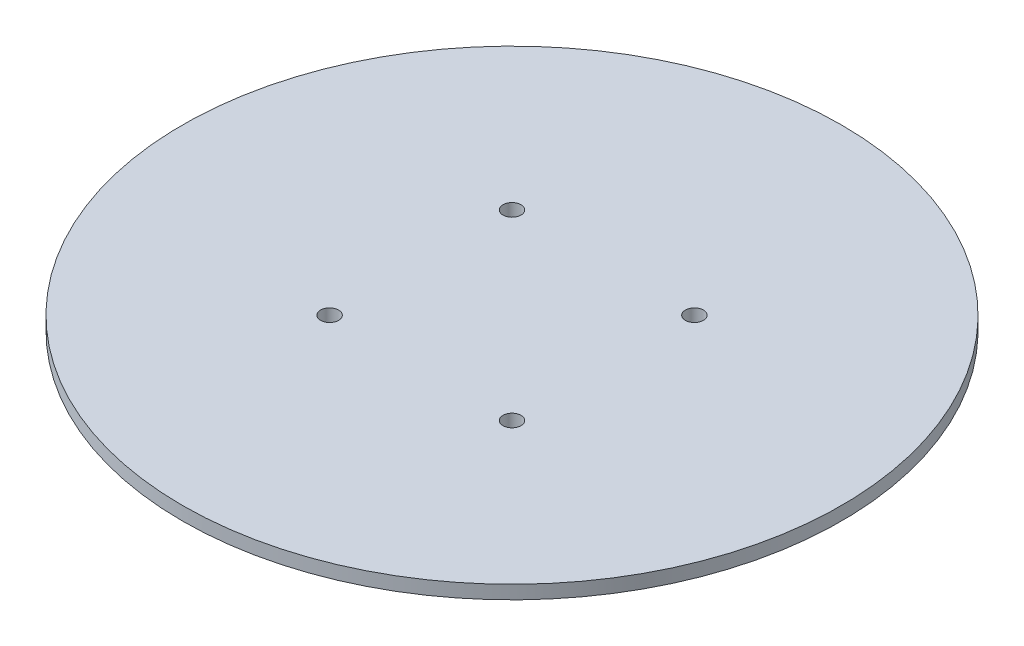
ISO-10303-21;
HEADER;
FILE_DESCRIPTION(('STEP AP214'),'2;1');
FILE_NAME('part.step','',(''),(''),'','','');
FILE_SCHEMA(('AUTOMOTIVE_DESIGN { 1 0 10303 214 1 1 1 1 }'));
ENDSEC;
DATA;
#1=APPLICATION_CONTEXT('core data for automotive mechanical design processes');
#2=APPLICATION_PROTOCOL_DEFINITION('international standard','automotive_design',2000,#1);
#3=PRODUCT_CONTEXT('',#1,'mechanical');
#4=PRODUCT('Part','Part','',(#3));
#5=PRODUCT_RELATED_PRODUCT_CATEGORY('part','',(#4));
#6=PRODUCT_DEFINITION_FORMATION('','',#4);
#7=PRODUCT_DEFINITION_CONTEXT('part definition',#1,'design');
#8=PRODUCT_DEFINITION('design','',#6,#7);
#9=PRODUCT_DEFINITION_SHAPE('','',#8);
#10=(LENGTH_UNIT() NAMED_UNIT(*) SI_UNIT(.MILLI.,.METRE.));
#11=(NAMED_UNIT(*) PLANE_ANGLE_UNIT() SI_UNIT($,.RADIAN.));
#12=(NAMED_UNIT(*) SI_UNIT($,.STERADIAN.) SOLID_ANGLE_UNIT());
#13=UNCERTAINTY_MEASURE_WITH_UNIT(LENGTH_MEASURE(1.E-05),#10,'distance_accuracy_value','');
#14=(GEOMETRIC_REPRESENTATION_CONTEXT(3) GLOBAL_UNCERTAINTY_ASSIGNED_CONTEXT((#13)) GLOBAL_UNIT_ASSIGNED_CONTEXT((#10,
#11,#12)) REPRESENTATION_CONTEXT('',''));
#15=CARTESIAN_POINT('',(0.,0.,0.));
#16=DIRECTION('',(0.,0.,1.));
#17=DIRECTION('',(1.,0.,0.));
#18=AXIS2_PLACEMENT_3D('',#15,#16,#17);
#19=CARTESIAN_POINT('',(0.,-1.5,0.));
#20=DIRECTION('',(0.,1.,0.));
#21=DIRECTION('',(0.,0.,1.));
#22=AXIS2_PLACEMENT_3D('',#19,#20,#21);
#23=CYLINDRICAL_SURFACE('',#22,73.2);
#24=CARTESIAN_POINT('',(0.,-1.5,0.));
#25=DIRECTION('',(0.,1.,0.));
#26=DIRECTION('',(0.,0.,1.));
#27=AXIS2_PLACEMENT_3D('',#24,#25,#26);
#28=CIRCLE('',#27,73.2);
#29=CARTESIAN_POINT('',(0.,-1.5,73.2));
#30=VERTEX_POINT('',#29);
#31=EDGE_CURVE('E10',#30,#30,#28,.T.);
#32=ORIENTED_EDGE('',*,*,#31,.T.);
#33=EDGE_LOOP('',(#32));
#34=FACE_BOUND('',#33,.T.);
#35=CARTESIAN_POINT('',(0.,1.5,0.));
#36=DIRECTION('',(0.,1.,0.));
#37=DIRECTION('',(0.,0.,1.));
#38=AXIS2_PLACEMENT_3D('',#35,#36,#37);
#39=CIRCLE('',#38,73.2);
#40=CARTESIAN_POINT('',(0.,1.5,73.2));
#41=VERTEX_POINT('',#40);
#42=EDGE_CURVE('E64',#41,#41,#39,.T.);
#43=ORIENTED_EDGE('',*,*,#42,.F.);
#44=EDGE_LOOP('',(#43));
#45=FACE_BOUND('',#44,.T.);
#46=ADVANCED_FACE('F37',(#34,#45),#23,.T.);
#47=CARTESIAN_POINT('',(0.,-1.5,0.));
#48=DIRECTION('',(0.,1.,0.));
#49=DIRECTION('',(0.,0.,1.));
#50=AXIS2_PLACEMENT_3D('',#47,#48,#49);
#51=PLANE('',#50);
#52=CARTESIAN_POINT('',(-20.2537855785615,-1.5,-20.2537855785619));
#53=DIRECTION('',(0.,1.,0.));
#54=DIRECTION('',(0.,0.,1.));
#55=AXIS2_PLACEMENT_3D('',#52,#53,#54);
#56=CIRCLE('',#55,2.);
#57=CARTESIAN_POINT('',(-20.2537855785615,-1.5,-18.2537855785619));
#58=VERTEX_POINT('',#57);
#59=EDGE_CURVE('E60',#58,#58,#56,.T.);
#60=ORIENTED_EDGE('',*,*,#59,.T.);
#61=EDGE_LOOP('',(#60));
#62=FACE_BOUND('',#61,.T.);
#63=CARTESIAN_POINT('',(-20.2537855785614,-1.5,20.2537855785636));
#64=DIRECTION('',(0.,1.,0.));
#65=DIRECTION('',(0.,0.,1.));
#66=AXIS2_PLACEMENT_3D('',#63,#64,#65);
#67=CIRCLE('',#66,1.99999999999979);
#68=CARTESIAN_POINT('',(-20.2537855785614,-1.5,22.2537855785634));
#69=VERTEX_POINT('',#68);
#70=EDGE_CURVE('E54',#69,#69,#67,.T.);
#71=ORIENTED_EDGE('',*,*,#70,.T.);
#72=EDGE_LOOP('',(#71));
#73=FACE_BOUND('',#72,.T.);
#74=CARTESIAN_POINT('',(20.2537855785636,-1.5,20.2537855785625));
#75=DIRECTION('',(0.,1.,0.));
#76=DIRECTION('',(0.,0.,1.));
#77=AXIS2_PLACEMENT_3D('',#74,#75,#76);
#78=CIRCLE('',#77,1.99999999999868);
#79=CARTESIAN_POINT('',(20.2537855785636,-1.5,22.2537855785612));
#80=VERTEX_POINT('',#79);
#81=EDGE_CURVE('E49',#80,#80,#78,.T.);
#82=ORIENTED_EDGE('',*,*,#81,.T.);
#83=EDGE_LOOP('',(#82));
#84=FACE_BOUND('',#83,.T.);
#85=CARTESIAN_POINT('',(20.2537855785617,-1.5,-20.2537855785617));
#86=DIRECTION('',(0.,1.,0.));
#87=DIRECTION('',(0.,0.,1.));
#88=AXIS2_PLACEMENT_3D('',#85,#86,#87);
#89=CIRCLE('',#88,2.);
#90=CARTESIAN_POINT('',(20.2537855785617,-1.5,-18.2537855785617));
#91=VERTEX_POINT('',#90);
#92=EDGE_CURVE('E44',#91,#91,#89,.T.);
#93=ORIENTED_EDGE('',*,*,#92,.T.);
#94=EDGE_LOOP('',(#93));
#95=FACE_BOUND('',#94,.T.);
#96=ORIENTED_EDGE('',*,*,#31,.F.);
#97=EDGE_LOOP('',(#96));
#98=FACE_BOUND('',#97,.T.);
#99=ADVANCED_FACE('F100',(#62,#73,#84,#95,#98),#51,.F.);
#100=CARTESIAN_POINT('',(20.2537855785617,-1.5,-20.2537855785617));
#101=DIRECTION('',(0.,1.,0.));
#102=DIRECTION('',(0.,0.,1.));
#103=AXIS2_PLACEMENT_3D('',#100,#101,#102);
#104=CYLINDRICAL_SURFACE('',#103,2.);
#105=ORIENTED_EDGE('',*,*,#92,.F.);
#106=EDGE_LOOP('',(#105));
#107=FACE_BOUND('',#106,.T.);
#108=CARTESIAN_POINT('',(20.2537855785617,1.5,-20.2537855785617));
#109=DIRECTION('',(0.,1.,0.));
#110=DIRECTION('',(0.,0.,1.));
#111=AXIS2_PLACEMENT_3D('',#108,#109,#110);
#112=CIRCLE('',#111,2.);
#113=CARTESIAN_POINT('',(20.2537855785617,1.5,-18.2537855785617));
#114=VERTEX_POINT('',#113);
#115=EDGE_CURVE('E68',#114,#114,#112,.T.);
#116=ORIENTED_EDGE('',*,*,#115,.T.);
#117=EDGE_LOOP('',(#116));
#118=FACE_BOUND('',#117,.T.);
#119=ADVANCED_FACE('F104',(#107,#118),#104,.F.);
#120=CARTESIAN_POINT('',(20.2537855785636,-1.5,20.2537855785625));
#121=DIRECTION('',(0.,1.,0.));
#122=DIRECTION('',(0.,0.,1.));
#123=AXIS2_PLACEMENT_3D('',#120,#121,#122);
#124=CYLINDRICAL_SURFACE('',#123,1.99999999999868);
#125=ORIENTED_EDGE('',*,*,#81,.F.);
#126=EDGE_LOOP('',(#125));
#127=FACE_BOUND('',#126,.T.);
#128=CARTESIAN_POINT('',(20.2537855785636,1.5,20.2537855785625));
#129=DIRECTION('',(0.,1.,0.));
#130=DIRECTION('',(0.,0.,1.));
#131=AXIS2_PLACEMENT_3D('',#128,#129,#130);
#132=CIRCLE('',#131,1.99999999999868);
#133=CARTESIAN_POINT('',(20.2537855785636,1.5,22.2537855785612));
#134=VERTEX_POINT('',#133);
#135=EDGE_CURVE('E72',#134,#134,#132,.T.);
#136=ORIENTED_EDGE('',*,*,#135,.T.);
#137=EDGE_LOOP('',(#136));
#138=FACE_BOUND('',#137,.T.);
#139=ADVANCED_FACE('F112',(#127,#138),#124,.F.);
#140=CARTESIAN_POINT('',(-20.2537855785614,-1.5,20.2537855785636));
#141=DIRECTION('',(0.,1.,0.));
#142=DIRECTION('',(0.,0.,1.));
#143=AXIS2_PLACEMENT_3D('',#140,#141,#142);
#144=CYLINDRICAL_SURFACE('',#143,1.99999999999979);
#145=ORIENTED_EDGE('',*,*,#70,.F.);
#146=EDGE_LOOP('',(#145));
#147=FACE_BOUND('',#146,.T.);
#148=CARTESIAN_POINT('',(-20.2537855785614,1.5,20.2537855785636));
#149=DIRECTION('',(0.,1.,0.));
#150=DIRECTION('',(0.,0.,1.));
#151=AXIS2_PLACEMENT_3D('',#148,#149,#150);
#152=CIRCLE('',#151,1.99999999999979);
#153=CARTESIAN_POINT('',(-20.2537855785614,1.5,22.2537855785634));
#154=VERTEX_POINT('',#153);
#155=EDGE_CURVE('E76',#154,#154,#152,.T.);
#156=ORIENTED_EDGE('',*,*,#155,.T.);
#157=EDGE_LOOP('',(#156));
#158=FACE_BOUND('',#157,.T.);
#159=ADVANCED_FACE('F94',(#147,#158),#144,.F.);
#160=CARTESIAN_POINT('',(-20.2537855785615,-1.5,-20.2537855785619));
#161=DIRECTION('',(0.,1.,0.));
#162=DIRECTION('',(0.,0.,1.));
#163=AXIS2_PLACEMENT_3D('',#160,#161,#162);
#164=CYLINDRICAL_SURFACE('',#163,2.);
#165=ORIENTED_EDGE('',*,*,#59,.F.);
#166=EDGE_LOOP('',(#165));
#167=FACE_BOUND('',#166,.T.);
#168=CARTESIAN_POINT('',(-20.2537855785615,1.5,-20.2537855785619));
#169=DIRECTION('',(0.,1.,0.));
#170=DIRECTION('',(0.,0.,1.));
#171=AXIS2_PLACEMENT_3D('',#168,#169,#170);
#172=CIRCLE('',#171,2.);
#173=CARTESIAN_POINT('',(-20.2537855785615,1.5,-18.2537855785619));
#174=VERTEX_POINT('',#173);
#175=EDGE_CURVE('E80',#174,#174,#172,.T.);
#176=ORIENTED_EDGE('',*,*,#175,.T.);
#177=EDGE_LOOP('',(#176));
#178=FACE_BOUND('',#177,.T.);
#179=ADVANCED_FACE('F85',(#167,#178),#164,.F.);
#180=CARTESIAN_POINT('',(0.,1.5,0.));
#181=DIRECTION('',(0.,1.,0.));
#182=DIRECTION('',(0.,0.,1.));
#183=AXIS2_PLACEMENT_3D('',#180,#181,#182);
#184=PLANE('',#183);
#185=ORIENTED_EDGE('',*,*,#155,.F.);
#186=EDGE_LOOP('',(#185));
#187=FACE_BOUND('',#186,.T.);
#188=ORIENTED_EDGE('',*,*,#115,.F.);
#189=EDGE_LOOP('',(#188));
#190=FACE_BOUND('',#189,.T.);
#191=ORIENTED_EDGE('',*,*,#42,.T.);
#192=EDGE_LOOP('',(#191));
#193=FACE_BOUND('',#192,.T.);
#194=ORIENTED_EDGE('',*,*,#135,.F.);
#195=EDGE_LOOP('',(#194));
#196=FACE_BOUND('',#195,.T.);
#197=ORIENTED_EDGE('',*,*,#175,.F.);
#198=EDGE_LOOP('',(#197));
#199=FACE_BOUND('',#198,.T.);
#200=ADVANCED_FACE('F87',(#187,#190,#193,#196,#199),#184,.T.);
#201=CLOSED_SHELL('',(#46,#99,#119,#139,#159,#179,#200));
#202=MANIFOLD_SOLID_BREP('B2',#201);
#203=ADVANCED_BREP_SHAPE_REPRESENTATION('',(#18,#202),#14);
#204=SHAPE_DEFINITION_REPRESENTATION(#9,#203);
ENDSEC;
END-ISO-10303-21;
